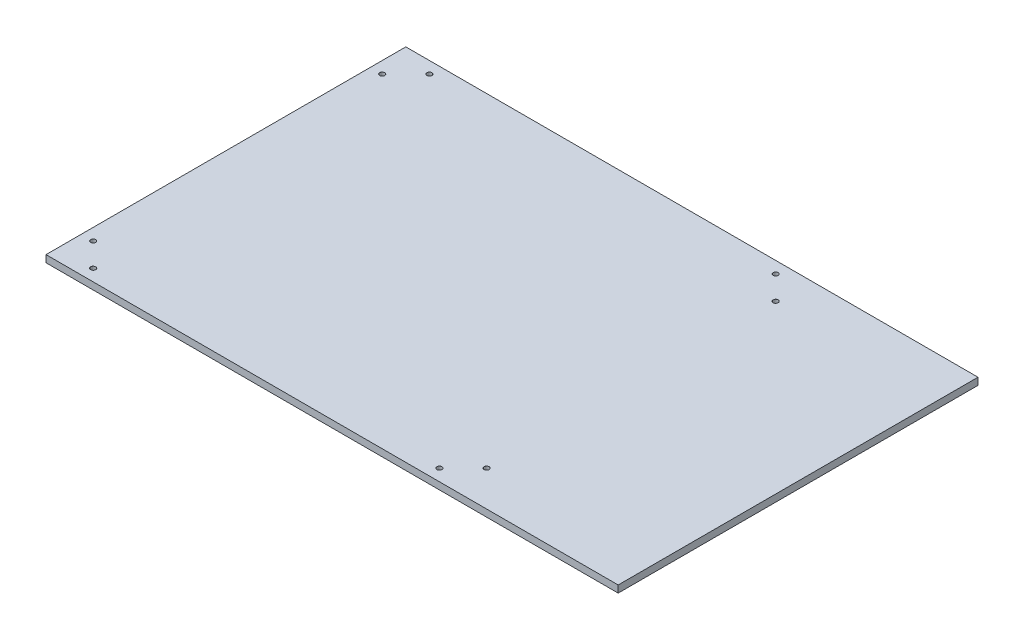
ISO-10303-21;
HEADER;
FILE_DESCRIPTION(('STEP AP214'),'2;1');
FILE_NAME('part.step','',(''),(''),'','','');
FILE_SCHEMA(('AUTOMOTIVE_DESIGN { 1 0 10303 214 1 1 1 1 }'));
ENDSEC;
DATA;
#1=APPLICATION_CONTEXT('core data for automotive mechanical design processes');
#2=APPLICATION_PROTOCOL_DEFINITION('international standard','automotive_design',2000,#1);
#3=PRODUCT_CONTEXT('',#1,'mechanical');
#4=PRODUCT('Part','Part','',(#3));
#5=PRODUCT_RELATED_PRODUCT_CATEGORY('part','',(#4));
#6=PRODUCT_DEFINITION_FORMATION('','',#4);
#7=PRODUCT_DEFINITION_CONTEXT('part definition',#1,'design');
#8=PRODUCT_DEFINITION('design','',#6,#7);
#9=PRODUCT_DEFINITION_SHAPE('','',#8);
#10=(LENGTH_UNIT() NAMED_UNIT(*) SI_UNIT(.MILLI.,.METRE.));
#11=(NAMED_UNIT(*) PLANE_ANGLE_UNIT() SI_UNIT($,.RADIAN.));
#12=(NAMED_UNIT(*) SI_UNIT($,.STERADIAN.) SOLID_ANGLE_UNIT());
#13=UNCERTAINTY_MEASURE_WITH_UNIT(LENGTH_MEASURE(1.E-05),#10,'distance_accuracy_value','');
#14=(GEOMETRIC_REPRESENTATION_CONTEXT(3) GLOBAL_UNCERTAINTY_ASSIGNED_CONTEXT((#13)) GLOBAL_UNIT_ASSIGNED_CONTEXT((#10,
#11,#12)) REPRESENTATION_CONTEXT('',''));
#15=CARTESIAN_POINT('',(0.,0.,0.));
#16=DIRECTION('',(0.,0.,1.));
#17=DIRECTION('',(1.,0.,0.));
#18=AXIS2_PLACEMENT_3D('',#15,#16,#17);
#19=CARTESIAN_POINT('',(-677.306733167082,12.,-361.633416458853));
#20=DIRECTION('',(1.,0.,0.));
#21=DIRECTION('',(0.,0.,-1.));
#22=AXIS2_PLACEMENT_3D('',#19,#20,#21);
#23=PLANE('',#22);
#24=DIRECTION('',(0.,0.,1.));
#25=VECTOR('',#24,1.);
#26=CARTESIAN_POINT('',(-677.306733167082,0.,-361.633416458853));
#27=LINE('',#26,#25);
#28=CARTESIAN_POINT('',(-677.306733167082,0.,-361.633416458853));
#29=VERTEX_POINT('',#28);
#30=CARTESIAN_POINT('',(-677.306733167082,0.,248.366583541147));
#31=VERTEX_POINT('',#30);
#32=EDGE_CURVE('E114',#29,#31,#27,.T.);
#33=ORIENTED_EDGE('',*,*,#32,.T.);
#34=DIRECTION('',(0.,-1.,0.));
#35=VECTOR('',#34,1.);
#36=CARTESIAN_POINT('',(-677.306733167082,12.,248.366583541147));
#37=LINE('',#36,#35);
#38=CARTESIAN_POINT('',(-677.306733167082,12.,248.366583541147));
#39=VERTEX_POINT('',#38);
#40=EDGE_CURVE('E11',#39,#31,#37,.T.);
#41=ORIENTED_EDGE('',*,*,#40,.F.);
#42=DIRECTION('',(0.,0.,1.));
#43=VECTOR('',#42,1.);
#44=CARTESIAN_POINT('',(-677.306733167082,12.,-361.633416458853));
#45=LINE('',#44,#43);
#46=CARTESIAN_POINT('',(-677.306733167082,12.,-361.633416458853));
#47=VERTEX_POINT('',#46);
#48=EDGE_CURVE('E102',#47,#39,#45,.T.);
#49=ORIENTED_EDGE('',*,*,#48,.F.);
#50=DIRECTION('',(0.,-1.,0.));
#51=VECTOR('',#50,1.);
#52=CARTESIAN_POINT('',(-677.306733167082,12.,-361.633416458853));
#53=LINE('',#52,#51);
#54=EDGE_CURVE('E110',#47,#29,#53,.T.);
#55=ORIENTED_EDGE('',*,*,#54,.T.);
#56=EDGE_LOOP('',(#33,#41,#49,#55));
#57=FACE_BOUND('',#56,.T.);
#58=ADVANCED_FACE('F51',(#57),#23,.F.);
#59=CARTESIAN_POINT('',(-677.306733167082,12.,248.366583541147));
#60=DIRECTION('',(0.,0.,-1.));
#61=DIRECTION('',(-1.,0.,0.));
#62=AXIS2_PLACEMENT_3D('',#59,#60,#61);
#63=PLANE('',#62);
#64=DIRECTION('',(1.,0.,0.));
#65=VECTOR('',#64,1.);
#66=CARTESIAN_POINT('',(-677.306733167082,0.,248.366583541147));
#67=LINE('',#66,#65);
#68=CARTESIAN_POINT('',(292.693266832918,0.,248.366583541147));
#69=VERTEX_POINT('',#68);
#70=EDGE_CURVE('E106',#31,#69,#67,.T.);
#71=ORIENTED_EDGE('',*,*,#70,.T.);
#72=DIRECTION('',(0.,-1.,0.));
#73=VECTOR('',#72,1.);
#74=CARTESIAN_POINT('',(292.693266832918,12.,248.366583541147));
#75=LINE('',#74,#73);
#76=CARTESIAN_POINT('',(292.693266832918,12.,248.366583541147));
#77=VERTEX_POINT('',#76);
#78=EDGE_CURVE('E59',#77,#69,#75,.T.);
#79=ORIENTED_EDGE('',*,*,#78,.F.);
#80=DIRECTION('',(1.,0.,0.));
#81=VECTOR('',#80,1.);
#82=CARTESIAN_POINT('',(-677.306733167082,12.,248.366583541147));
#83=LINE('',#82,#81);
#84=EDGE_CURVE('E97',#39,#77,#83,.T.);
#85=ORIENTED_EDGE('',*,*,#84,.F.);
#86=ORIENTED_EDGE('',*,*,#40,.T.);
#87=EDGE_LOOP('',(#71,#79,#85,#86));
#88=FACE_BOUND('',#87,.T.);
#89=ADVANCED_FACE('F105',(#88),#63,.F.);
#90=CARTESIAN_POINT('',(292.693266832918,12.,-361.633416458853));
#91=DIRECTION('',(-1.,0.,0.));
#92=DIRECTION('',(0.,0.,1.));
#93=AXIS2_PLACEMENT_3D('',#90,#91,#92);
#94=PLANE('',#93);
#95=DIRECTION('',(0.,0.,-1.));
#96=VECTOR('',#95,1.);
#97=CARTESIAN_POINT('',(292.693266832918,0.,-361.633416458853));
#98=LINE('',#97,#96);
#99=CARTESIAN_POINT('',(292.693266832918,0.,-361.633416458853));
#100=VERTEX_POINT('',#99);
#101=EDGE_CURVE('E84',#69,#100,#98,.T.);
#102=ORIENTED_EDGE('',*,*,#101,.T.);
#103=DIRECTION('',(0.,-1.,0.));
#104=VECTOR('',#103,1.);
#105=CARTESIAN_POINT('',(292.693266832918,12.,-361.633416458853));
#106=LINE('',#105,#104);
#107=CARTESIAN_POINT('',(292.693266832918,12.,-361.633416458853));
#108=VERTEX_POINT('',#107);
#109=EDGE_CURVE('E107',#108,#100,#106,.T.);
#110=ORIENTED_EDGE('',*,*,#109,.F.);
#111=DIRECTION('',(0.,0.,-1.));
#112=VECTOR('',#111,1.);
#113=CARTESIAN_POINT('',(292.693266832918,12.,-361.633416458853));
#114=LINE('',#113,#112);
#115=EDGE_CURVE('E100',#77,#108,#114,.T.);
#116=ORIENTED_EDGE('',*,*,#115,.F.);
#117=ORIENTED_EDGE('',*,*,#78,.T.);
#118=EDGE_LOOP('',(#102,#110,#116,#117));
#119=FACE_BOUND('',#118,.T.);
#120=ADVANCED_FACE('F108',(#119),#94,.F.);
#121=CARTESIAN_POINT('',(-677.306733167082,12.,-361.633416458853));
#122=DIRECTION('',(0.,0.,1.));
#123=DIRECTION('',(1.,0.,0.));
#124=AXIS2_PLACEMENT_3D('',#121,#122,#123);
#125=PLANE('',#124);
#126=DIRECTION('',(-1.,0.,0.));
#127=VECTOR('',#126,1.);
#128=CARTESIAN_POINT('',(-677.306733167082,0.,-361.633416458853));
#129=LINE('',#128,#127);
#130=EDGE_CURVE('E90',#100,#29,#129,.T.);
#131=ORIENTED_EDGE('',*,*,#130,.T.);
#132=ORIENTED_EDGE('',*,*,#54,.F.);
#133=DIRECTION('',(-1.,0.,0.));
#134=VECTOR('',#133,1.);
#135=CARTESIAN_POINT('',(-677.306733167082,12.,-361.633416458853));
#136=LINE('',#135,#134);
#137=EDGE_CURVE('E67',#108,#47,#136,.T.);
#138=ORIENTED_EDGE('',*,*,#137,.F.);
#139=ORIENTED_EDGE('',*,*,#109,.T.);
#140=EDGE_LOOP('',(#131,#132,#138,#139));
#141=FACE_BOUND('',#140,.T.);
#142=ADVANCED_FACE('F122',(#141),#125,.F.);
#143=CARTESIAN_POINT('',(0.,12.,0.));
#144=DIRECTION('',(0.,1.,0.));
#145=DIRECTION('',(0.,0.,1.));
#146=AXIS2_PLACEMENT_3D('',#143,#144,#145);
#147=PLANE('',#146);
#148=CARTESIAN_POINT('',(-617.306733167106,12.,-341.633416458855));
#149=DIRECTION('',(0.,1.,0.));
#150=DIRECTION('',(0.,0.,1.));
#151=AXIS2_PLACEMENT_3D('',#148,#149,#150);
#152=CIRCLE('',#151,4.27500000000003);
#153=CARTESIAN_POINT('',(-617.306733167106,12.,-337.358416458855));
#154=VERTEX_POINT('',#153);
#155=EDGE_CURVE('E193',#154,#154,#152,.T.);
#156=ORIENTED_EDGE('',*,*,#155,.F.);
#157=EDGE_LOOP('',(#156));
#158=FACE_BOUND('',#157,.T.);
#159=CARTESIAN_POINT('',(-657.306733167082,12.,-301.633416458863));
#160=DIRECTION('',(0.,1.,0.));
#161=DIRECTION('',(0.,0.,1.));
#162=AXIS2_PLACEMENT_3D('',#159,#160,#161);
#163=CIRCLE('',#162,4.27500000000003);
#164=CARTESIAN_POINT('',(-657.306733167082,12.,-297.358416458863));
#165=VERTEX_POINT('',#164);
#166=EDGE_CURVE('E184',#165,#165,#163,.T.);
#167=ORIENTED_EDGE('',*,*,#166,.F.);
#168=EDGE_LOOP('',(#167));
#169=FACE_BOUND('',#168,.T.);
#170=CARTESIAN_POINT('',(-617.306733167079,12.,228.366583541145));
#171=DIRECTION('',(0.,1.,0.));
#172=DIRECTION('',(0.,0.,1.));
#173=AXIS2_PLACEMENT_3D('',#170,#171,#172);
#174=CIRCLE('',#173,4.27500000000003);
#175=CARTESIAN_POINT('',(-617.306733167079,12.,232.641583541145));
#176=VERTEX_POINT('',#175);
#177=EDGE_CURVE('E175',#176,#176,#174,.T.);
#178=ORIENTED_EDGE('',*,*,#177,.F.);
#179=EDGE_LOOP('',(#178));
#180=FACE_BOUND('',#179,.T.);
#181=CARTESIAN_POINT('',(-657.306733167091,12.,188.366583541161));
#182=DIRECTION('',(0.,1.,0.));
#183=DIRECTION('',(0.,0.,1.));
#184=AXIS2_PLACEMENT_3D('',#181,#182,#183);
#185=CIRCLE('',#184,4.27500000000003);
#186=CARTESIAN_POINT('',(-657.306733167091,12.,192.641583541161));
#187=VERTEX_POINT('',#186);
#188=EDGE_CURVE('E166',#187,#187,#185,.T.);
#189=ORIENTED_EDGE('',*,*,#188,.F.);
#190=EDGE_LOOP('',(#189));
#191=FACE_BOUND('',#190,.T.);
#192=CARTESIAN_POINT('',(9.69326683290912,12.,188.366583541161));
#193=DIRECTION('',(0.,1.,0.));
#194=DIRECTION('',(0.,0.,1.));
#195=AXIS2_PLACEMENT_3D('',#192,#193,#194);
#196=CIRCLE('',#195,4.275);
#197=CARTESIAN_POINT('',(9.69326683290912,12.,192.641583541161));
#198=VERTEX_POINT('',#197);
#199=EDGE_CURVE('E157',#198,#198,#196,.T.);
#200=ORIENTED_EDGE('',*,*,#199,.F.);
#201=EDGE_LOOP('',(#200));
#202=FACE_BOUND('',#201,.T.);
#203=CARTESIAN_POINT('',(-30.3067331671783,12.,228.3665835689));
#204=DIRECTION('',(0.,1.,0.));
#205=DIRECTION('',(0.,0.,1.));
#206=AXIS2_PLACEMENT_3D('',#203,#204,#205);
#207=CIRCLE('',#206,4.275);
#208=CARTESIAN_POINT('',(-30.3067331671783,12.,232.6415835689));
#209=VERTEX_POINT('',#208);
#210=EDGE_CURVE('E148',#209,#209,#207,.T.);
#211=ORIENTED_EDGE('',*,*,#210,.F.);
#212=EDGE_LOOP('',(#211));
#213=FACE_BOUND('',#212,.T.);
#214=CARTESIAN_POINT('',(9.69326683313173,12.,-301.633416458863));
#215=DIRECTION('',(0.,1.,0.));
#216=DIRECTION('',(0.,0.,1.));
#217=AXIS2_PLACEMENT_3D('',#214,#215,#216);
#218=CIRCLE('',#217,4.275);
#219=CARTESIAN_POINT('',(9.69326683313173,12.,-297.358416458863));
#220=VERTEX_POINT('',#219);
#221=EDGE_CURVE('E139',#220,#220,#218,.T.);
#222=ORIENTED_EDGE('',*,*,#221,.F.);
#223=EDGE_LOOP('',(#222));
#224=FACE_BOUND('',#223,.T.);
#225=CARTESIAN_POINT('',(-30.2953740803998,12.,-341.62197439886));
#226=DIRECTION('',(0.,1.,0.));
#227=DIRECTION('',(0.,0.,1.));
#228=AXIS2_PLACEMENT_3D('',#225,#226,#227);
#229=CIRCLE('',#228,4.23387704696615);
#230=CARTESIAN_POINT('',(-30.2953740803998,12.,-337.388097351894));
#231=VERTEX_POINT('',#230);
#232=EDGE_CURVE('E128',#231,#231,#229,.T.);
#233=ORIENTED_EDGE('',*,*,#232,.F.);
#234=EDGE_LOOP('',(#233));
#235=FACE_BOUND('',#234,.T.);
#236=ORIENTED_EDGE('',*,*,#48,.T.);
#237=ORIENTED_EDGE('',*,*,#84,.T.);
#238=ORIENTED_EDGE('',*,*,#115,.T.);
#239=ORIENTED_EDGE('',*,*,#137,.T.);
#240=EDGE_LOOP('',(#236,#237,#238,#239));
#241=FACE_BOUND('',#240,.T.);
#242=ADVANCED_FACE('F98',(#158,#169,#180,#191,#202,#213,#224,#235,#241),#147,.T.);
#243=CARTESIAN_POINT('',(0.,0.,0.));
#244=DIRECTION('',(0.,1.,0.));
#245=DIRECTION('',(0.,0.,1.));
#246=AXIS2_PLACEMENT_3D('',#243,#244,#245);
#247=PLANE('',#246);
#248=CARTESIAN_POINT('',(-617.306733167106,0.,-341.633416458855));
#249=DIRECTION('',(0.,1.,0.));
#250=DIRECTION('',(0.,0.,1.));
#251=AXIS2_PLACEMENT_3D('',#248,#249,#250);
#252=CIRCLE('',#251,4.24999999999998);
#253=CARTESIAN_POINT('',(-617.306733167106,0.,-337.383416458855));
#254=VERTEX_POINT('',#253);
#255=EDGE_CURVE('E187',#254,#254,#252,.T.);
#256=ORIENTED_EDGE('',*,*,#255,.T.);
#257=EDGE_LOOP('',(#256));
#258=FACE_BOUND('',#257,.T.);
#259=CARTESIAN_POINT('',(-657.306733167082,0.,-301.633416458863));
#260=DIRECTION('',(0.,1.,0.));
#261=DIRECTION('',(0.,0.,1.));
#262=AXIS2_PLACEMENT_3D('',#259,#260,#261);
#263=CIRCLE('',#262,4.24999999999998);
#264=CARTESIAN_POINT('',(-657.306733167082,0.,-297.383416458863));
#265=VERTEX_POINT('',#264);
#266=EDGE_CURVE('E178',#265,#265,#263,.T.);
#267=ORIENTED_EDGE('',*,*,#266,.T.);
#268=EDGE_LOOP('',(#267));
#269=FACE_BOUND('',#268,.T.);
#270=CARTESIAN_POINT('',(-617.306733167079,0.,228.366583541145));
#271=DIRECTION('',(0.,1.,0.));
#272=DIRECTION('',(0.,0.,1.));
#273=AXIS2_PLACEMENT_3D('',#270,#271,#272);
#274=CIRCLE('',#273,4.24999999999998);
#275=CARTESIAN_POINT('',(-617.306733167079,0.,232.616583541145));
#276=VERTEX_POINT('',#275);
#277=EDGE_CURVE('E169',#276,#276,#274,.T.);
#278=ORIENTED_EDGE('',*,*,#277,.T.);
#279=EDGE_LOOP('',(#278));
#280=FACE_BOUND('',#279,.T.);
#281=CARTESIAN_POINT('',(-657.306733167091,0.,188.366583541161));
#282=DIRECTION('',(0.,1.,0.));
#283=DIRECTION('',(0.,0.,1.));
#284=AXIS2_PLACEMENT_3D('',#281,#282,#283);
#285=CIRCLE('',#284,4.24999999999998);
#286=CARTESIAN_POINT('',(-657.306733167091,0.,192.616583541161));
#287=VERTEX_POINT('',#286);
#288=EDGE_CURVE('E160',#287,#287,#285,.T.);
#289=ORIENTED_EDGE('',*,*,#288,.T.);
#290=EDGE_LOOP('',(#289));
#291=FACE_BOUND('',#290,.T.);
#292=CARTESIAN_POINT('',(9.69326683290912,0.,188.366583541161));
#293=DIRECTION('',(0.,1.,0.));
#294=DIRECTION('',(0.,0.,1.));
#295=AXIS2_PLACEMENT_3D('',#292,#293,#294);
#296=CIRCLE('',#295,4.25);
#297=CARTESIAN_POINT('',(9.69326683290912,0.,192.616583541161));
#298=VERTEX_POINT('',#297);
#299=EDGE_CURVE('E151',#298,#298,#296,.T.);
#300=ORIENTED_EDGE('',*,*,#299,.T.);
#301=EDGE_LOOP('',(#300));
#302=FACE_BOUND('',#301,.T.);
#303=CARTESIAN_POINT('',(-30.3067331671783,0.,228.3665835689));
#304=DIRECTION('',(0.,1.,0.));
#305=DIRECTION('',(0.,0.,1.));
#306=AXIS2_PLACEMENT_3D('',#303,#304,#305);
#307=CIRCLE('',#306,4.25);
#308=CARTESIAN_POINT('',(-30.3067331671783,0.,232.6165835689));
#309=VERTEX_POINT('',#308);
#310=EDGE_CURVE('E142',#309,#309,#307,.T.);
#311=ORIENTED_EDGE('',*,*,#310,.T.);
#312=EDGE_LOOP('',(#311));
#313=FACE_BOUND('',#312,.T.);
#314=CARTESIAN_POINT('',(9.69326683313173,0.,-301.633416458863));
#315=DIRECTION('',(0.,1.,0.));
#316=DIRECTION('',(0.,0.,1.));
#317=AXIS2_PLACEMENT_3D('',#314,#315,#316);
#318=CIRCLE('',#317,4.25);
#319=CARTESIAN_POINT('',(9.69326683313173,0.,-297.383416458863));
#320=VERTEX_POINT('',#319);
#321=EDGE_CURVE('E131',#320,#320,#318,.T.);
#322=ORIENTED_EDGE('',*,*,#321,.T.);
#323=EDGE_LOOP('',(#322));
#324=FACE_BOUND('',#323,.T.);
#325=ORIENTED_EDGE('',*,*,#32,.F.);
#326=ORIENTED_EDGE('',*,*,#130,.F.);
#327=ORIENTED_EDGE('',*,*,#101,.F.);
#328=ORIENTED_EDGE('',*,*,#70,.F.);
#329=EDGE_LOOP('',(#325,#326,#327,#328));
#330=FACE_BOUND('',#329,.T.);
#331=ADVANCED_FACE('F125',(#258,#269,#280,#291,#302,#313,#324,#330),#247,.F.);
#332=CARTESIAN_POINT('',(-30.2953740803998,2.,-341.62197439886));
#333=DIRECTION('',(0.,1.,0.));
#334=DIRECTION('',(0.,0.,1.));
#335=AXIS2_PLACEMENT_3D('',#332,#333,#334);
#336=CYLINDRICAL_SURFACE('',#335,4.23387704696615);
#337=CARTESIAN_POINT('',(-30.2953740803998,2.,-341.62197439886));
#338=DIRECTION('',(0.,1.,0.));
#339=DIRECTION('',(0.,0.,1.));
#340=AXIS2_PLACEMENT_3D('',#337,#338,#339);
#341=CIRCLE('',#340,4.23387704696615);
#342=CARTESIAN_POINT('',(-30.2953740803998,2.,-337.388097351894));
#343=VERTEX_POINT('',#342);
#344=EDGE_CURVE('E117',#343,#343,#341,.T.);
#345=ORIENTED_EDGE('',*,*,#344,.F.);
#346=EDGE_LOOP('',(#345));
#347=FACE_BOUND('',#346,.T.);
#348=ORIENTED_EDGE('',*,*,#232,.T.);
#349=EDGE_LOOP('',(#348));
#350=FACE_BOUND('',#349,.T.);
#351=ADVANCED_FACE('F216',(#347,#350),#336,.F.);
#352=CARTESIAN_POINT('',(-30.2953740803998,2.,-341.62197439886));
#353=DIRECTION('',(0.,1.,0.));
#354=DIRECTION('',(0.,0.,1.));
#355=AXIS2_PLACEMENT_3D('',#352,#353,#354);
#356=PLANE('',#355);
#357=ORIENTED_EDGE('',*,*,#344,.T.);
#358=EDGE_LOOP('',(#357));
#359=FACE_BOUND('',#358,.T.);
#360=ADVANCED_FACE('F218',(#359),#356,.T.);
#361=CARTESIAN_POINT('',(9.69326683313173,12.,-301.633416458863));
#362=DIRECTION('',(0.,1.,0.));
#363=DIRECTION('',(0.,0.,1.));
#364=AXIS2_PLACEMENT_3D('',#361,#362,#363);
#365=CYLINDRICAL_SURFACE('',#364,4.25);
#366=ORIENTED_EDGE('',*,*,#321,.F.);
#367=EDGE_LOOP('',(#366));
#368=FACE_BOUND('',#367,.T.);
#369=CARTESIAN_POINT('',(9.69326683313173,11.975,-301.633416458863));
#370=DIRECTION('',(0.,1.,0.));
#371=DIRECTION('',(0.,0.,1.));
#372=AXIS2_PLACEMENT_3D('',#369,#370,#371);
#373=CIRCLE('',#372,4.25);
#374=CARTESIAN_POINT('',(9.69326683313173,11.975,-297.383416458863));
#375=VERTEX_POINT('',#374);
#376=EDGE_CURVE('E136',#375,#375,#373,.T.);
#377=ORIENTED_EDGE('',*,*,#376,.T.);
#378=EDGE_LOOP('',(#377));
#379=FACE_BOUND('',#378,.T.);
#380=ADVANCED_FACE('F225',(#368,#379),#365,.F.);
#381=CARTESIAN_POINT('',(9.69326683313173,12.,-301.633416458863));
#382=DIRECTION('',(0.,1.,0.));
#383=DIRECTION('',(0.,0.,1.));
#384=AXIS2_PLACEMENT_3D('',#381,#382,#383);
#385=CONICAL_SURFACE('',#384,4.275,0.785398163397414);
#386=ORIENTED_EDGE('',*,*,#376,.F.);
#387=EDGE_LOOP('',(#386));
#388=FACE_BOUND('',#387,.T.);
#389=ORIENTED_EDGE('',*,*,#221,.T.);
#390=EDGE_LOOP('',(#389));
#391=FACE_BOUND('',#390,.T.);
#392=ADVANCED_FACE('F286',(#388,#391),#385,.F.);
#393=CARTESIAN_POINT('',(-30.3067331671783,12.,228.3665835689));
#394=DIRECTION('',(0.,1.,0.));
#395=DIRECTION('',(0.,0.,1.));
#396=AXIS2_PLACEMENT_3D('',#393,#394,#395);
#397=CYLINDRICAL_SURFACE('',#396,4.25);
#398=ORIENTED_EDGE('',*,*,#310,.F.);
#399=EDGE_LOOP('',(#398));
#400=FACE_BOUND('',#399,.T.);
#401=CARTESIAN_POINT('',(-30.3067331671783,11.975,228.3665835689));
#402=DIRECTION('',(0.,1.,0.));
#403=DIRECTION('',(0.,0.,1.));
#404=AXIS2_PLACEMENT_3D('',#401,#402,#403);
#405=CIRCLE('',#404,4.25);
#406=CARTESIAN_POINT('',(-30.3067331671783,11.975,232.6165835689));
#407=VERTEX_POINT('',#406);
#408=EDGE_CURVE('E145',#407,#407,#405,.T.);
#409=ORIENTED_EDGE('',*,*,#408,.T.);
#410=EDGE_LOOP('',(#409));
#411=FACE_BOUND('',#410,.T.);
#412=ADVANCED_FACE('F295',(#400,#411),#397,.F.);
#413=CARTESIAN_POINT('',(-30.3067331671783,12.,228.3665835689));
#414=DIRECTION('',(0.,1.,0.));
#415=DIRECTION('',(0.,0.,1.));
#416=AXIS2_PLACEMENT_3D('',#413,#414,#415);
#417=CONICAL_SURFACE('',#416,4.275,0.785398163397414);
#418=ORIENTED_EDGE('',*,*,#408,.F.);
#419=EDGE_LOOP('',(#418));
#420=FACE_BOUND('',#419,.T.);
#421=ORIENTED_EDGE('',*,*,#210,.T.);
#422=EDGE_LOOP('',(#421));
#423=FACE_BOUND('',#422,.T.);
#424=ADVANCED_FACE('F304',(#420,#423),#417,.F.);
#425=CARTESIAN_POINT('',(9.69326683290912,12.,188.366583541161));
#426=DIRECTION('',(0.,1.,0.));
#427=DIRECTION('',(0.,0.,1.));
#428=AXIS2_PLACEMENT_3D('',#425,#426,#427);
#429=CYLINDRICAL_SURFACE('',#428,4.25);
#430=ORIENTED_EDGE('',*,*,#299,.F.);
#431=EDGE_LOOP('',(#430));
#432=FACE_BOUND('',#431,.T.);
#433=CARTESIAN_POINT('',(9.69326683290912,11.975,188.366583541161));
#434=DIRECTION('',(0.,1.,0.));
#435=DIRECTION('',(0.,0.,1.));
#436=AXIS2_PLACEMENT_3D('',#433,#434,#435);
#437=CIRCLE('',#436,4.25);
#438=CARTESIAN_POINT('',(9.69326683290912,11.975,192.616583541161));
#439=VERTEX_POINT('',#438);
#440=EDGE_CURVE('E154',#439,#439,#437,.T.);
#441=ORIENTED_EDGE('',*,*,#440,.T.);
#442=EDGE_LOOP('',(#441));
#443=FACE_BOUND('',#442,.T.);
#444=ADVANCED_FACE('F313',(#432,#443),#429,.F.);
#445=CARTESIAN_POINT('',(9.69326683290912,12.,188.366583541161));
#446=DIRECTION('',(0.,1.,0.));
#447=DIRECTION('',(0.,0.,1.));
#448=AXIS2_PLACEMENT_3D('',#445,#446,#447);
#449=CONICAL_SURFACE('',#448,4.275,0.785398163397414);
#450=ORIENTED_EDGE('',*,*,#440,.F.);
#451=EDGE_LOOP('',(#450));
#452=FACE_BOUND('',#451,.T.);
#453=ORIENTED_EDGE('',*,*,#199,.T.);
#454=EDGE_LOOP('',(#453));
#455=FACE_BOUND('',#454,.T.);
#456=ADVANCED_FACE('F322',(#452,#455),#449,.F.);
#457=CARTESIAN_POINT('',(-657.306733167091,12.,188.366583541161));
#458=DIRECTION('',(0.,1.,0.));
#459=DIRECTION('',(0.,0.,1.));
#460=AXIS2_PLACEMENT_3D('',#457,#458,#459);
#461=CYLINDRICAL_SURFACE('',#460,4.24999999999998);
#462=ORIENTED_EDGE('',*,*,#288,.F.);
#463=EDGE_LOOP('',(#462));
#464=FACE_BOUND('',#463,.T.);
#465=CARTESIAN_POINT('',(-657.306733167091,11.975,188.366583541161));
#466=DIRECTION('',(0.,1.,0.));
#467=DIRECTION('',(0.,0.,1.));
#468=AXIS2_PLACEMENT_3D('',#465,#466,#467);
#469=CIRCLE('',#468,4.24999999999998);
#470=CARTESIAN_POINT('',(-657.306733167091,11.975,192.616583541161));
#471=VERTEX_POINT('',#470);
#472=EDGE_CURVE('E163',#471,#471,#469,.T.);
#473=ORIENTED_EDGE('',*,*,#472,.T.);
#474=EDGE_LOOP('',(#473));
#475=FACE_BOUND('',#474,.T.);
#476=ADVANCED_FACE('F331',(#464,#475),#461,.F.);
#477=CARTESIAN_POINT('',(-657.306733167091,12.,188.366583541161));
#478=DIRECTION('',(0.,1.,0.));
#479=DIRECTION('',(0.,0.,1.));
#480=AXIS2_PLACEMENT_3D('',#477,#478,#479);
#481=CONICAL_SURFACE('',#480,4.27500000000003,0.785398163398454);
#482=ORIENTED_EDGE('',*,*,#472,.F.);
#483=EDGE_LOOP('',(#482));
#484=FACE_BOUND('',#483,.T.);
#485=ORIENTED_EDGE('',*,*,#188,.T.);
#486=EDGE_LOOP('',(#485));
#487=FACE_BOUND('',#486,.T.);
#488=ADVANCED_FACE('F340',(#484,#487),#481,.F.);
#489=CARTESIAN_POINT('',(-617.306733167079,12.,228.366583541145));
#490=DIRECTION('',(0.,1.,0.));
#491=DIRECTION('',(0.,0.,1.));
#492=AXIS2_PLACEMENT_3D('',#489,#490,#491);
#493=CYLINDRICAL_SURFACE('',#492,4.24999999999998);
#494=ORIENTED_EDGE('',*,*,#277,.F.);
#495=EDGE_LOOP('',(#494));
#496=FACE_BOUND('',#495,.T.);
#497=CARTESIAN_POINT('',(-617.306733167079,11.975,228.366583541145));
#498=DIRECTION('',(0.,1.,0.));
#499=DIRECTION('',(0.,0.,1.));
#500=AXIS2_PLACEMENT_3D('',#497,#498,#499);
#501=CIRCLE('',#500,4.24999999999998);
#502=CARTESIAN_POINT('',(-617.306733167079,11.975,232.616583541145));
#503=VERTEX_POINT('',#502);
#504=EDGE_CURVE('E172',#503,#503,#501,.T.);
#505=ORIENTED_EDGE('',*,*,#504,.T.);
#506=EDGE_LOOP('',(#505));
#507=FACE_BOUND('',#506,.T.);
#508=ADVANCED_FACE('F349',(#496,#507),#493,.F.);
#509=CARTESIAN_POINT('',(-617.306733167079,12.,228.366583541145));
#510=DIRECTION('',(0.,1.,0.));
#511=DIRECTION('',(0.,0.,1.));
#512=AXIS2_PLACEMENT_3D('',#509,#510,#511);
#513=CONICAL_SURFACE('',#512,4.27500000000003,0.785398163398454);
#514=ORIENTED_EDGE('',*,*,#504,.F.);
#515=EDGE_LOOP('',(#514));
#516=FACE_BOUND('',#515,.T.);
#517=ORIENTED_EDGE('',*,*,#177,.T.);
#518=EDGE_LOOP('',(#517));
#519=FACE_BOUND('',#518,.T.);
#520=ADVANCED_FACE('F358',(#516,#519),#513,.F.);
#521=CARTESIAN_POINT('',(-657.306733167082,12.,-301.633416458863));
#522=DIRECTION('',(0.,1.,0.));
#523=DIRECTION('',(0.,0.,1.));
#524=AXIS2_PLACEMENT_3D('',#521,#522,#523);
#525=CYLINDRICAL_SURFACE('',#524,4.24999999999998);
#526=ORIENTED_EDGE('',*,*,#266,.F.);
#527=EDGE_LOOP('',(#526));
#528=FACE_BOUND('',#527,.T.);
#529=CARTESIAN_POINT('',(-657.306733167082,11.975,-301.633416458863));
#530=DIRECTION('',(0.,1.,0.));
#531=DIRECTION('',(0.,0.,1.));
#532=AXIS2_PLACEMENT_3D('',#529,#530,#531);
#533=CIRCLE('',#532,4.24999999999998);
#534=CARTESIAN_POINT('',(-657.306733167082,11.975,-297.383416458863));
#535=VERTEX_POINT('',#534);
#536=EDGE_CURVE('E181',#535,#535,#533,.T.);
#537=ORIENTED_EDGE('',*,*,#536,.T.);
#538=EDGE_LOOP('',(#537));
#539=FACE_BOUND('',#538,.T.);
#540=ADVANCED_FACE('F367',(#528,#539),#525,.F.);
#541=CARTESIAN_POINT('',(-657.306733167082,12.,-301.633416458863));
#542=DIRECTION('',(0.,1.,0.));
#543=DIRECTION('',(0.,0.,1.));
#544=AXIS2_PLACEMENT_3D('',#541,#542,#543);
#545=CONICAL_SURFACE('',#544,4.27500000000003,0.785398163398454);
#546=ORIENTED_EDGE('',*,*,#536,.F.);
#547=EDGE_LOOP('',(#546));
#548=FACE_BOUND('',#547,.T.);
#549=ORIENTED_EDGE('',*,*,#166,.T.);
#550=EDGE_LOOP('',(#549));
#551=FACE_BOUND('',#550,.T.);
#552=ADVANCED_FACE('F376',(#548,#551),#545,.F.);
#553=CARTESIAN_POINT('',(-617.306733167106,12.,-341.633416458855));
#554=DIRECTION('',(0.,1.,0.));
#555=DIRECTION('',(0.,0.,1.));
#556=AXIS2_PLACEMENT_3D('',#553,#554,#555);
#557=CYLINDRICAL_SURFACE('',#556,4.24999999999998);
#558=ORIENTED_EDGE('',*,*,#255,.F.);
#559=EDGE_LOOP('',(#558));
#560=FACE_BOUND('',#559,.T.);
#561=CARTESIAN_POINT('',(-617.306733167106,11.975,-341.633416458855));
#562=DIRECTION('',(0.,1.,0.));
#563=DIRECTION('',(0.,0.,1.));
#564=AXIS2_PLACEMENT_3D('',#561,#562,#563);
#565=CIRCLE('',#564,4.24999999999998);
#566=CARTESIAN_POINT('',(-617.306733167106,11.975,-337.383416458855));
#567=VERTEX_POINT('',#566);
#568=EDGE_CURVE('E190',#567,#567,#565,.T.);
#569=ORIENTED_EDGE('',*,*,#568,.T.);
#570=EDGE_LOOP('',(#569));
#571=FACE_BOUND('',#570,.T.);
#572=ADVANCED_FACE('F385',(#560,#571),#557,.F.);
#573=CARTESIAN_POINT('',(-617.306733167106,12.,-341.633416458855));
#574=DIRECTION('',(0.,1.,0.));
#575=DIRECTION('',(0.,0.,1.));
#576=AXIS2_PLACEMENT_3D('',#573,#574,#575);
#577=CONICAL_SURFACE('',#576,4.27500000000003,0.785398163398454);
#578=ORIENTED_EDGE('',*,*,#568,.F.);
#579=EDGE_LOOP('',(#578));
#580=FACE_BOUND('',#579,.T.);
#581=ORIENTED_EDGE('',*,*,#155,.T.);
#582=EDGE_LOOP('',(#581));
#583=FACE_BOUND('',#582,.T.);
#584=ADVANCED_FACE('F197',(#580,#583),#577,.F.);
#585=CLOSED_SHELL('',(#58,#89,#120,#142,#242,#331,#351,#360,#380,#392,#412,#424,#444,#456,#476,
#488,#508,#520,#540,#552,#572,#584));
#586=MANIFOLD_SOLID_BREP('B2',#585);
#587=ADVANCED_BREP_SHAPE_REPRESENTATION('',(#18,#586),#14);
#588=SHAPE_DEFINITION_REPRESENTATION(#9,#587);
ENDSEC;
END-ISO-10303-21;
